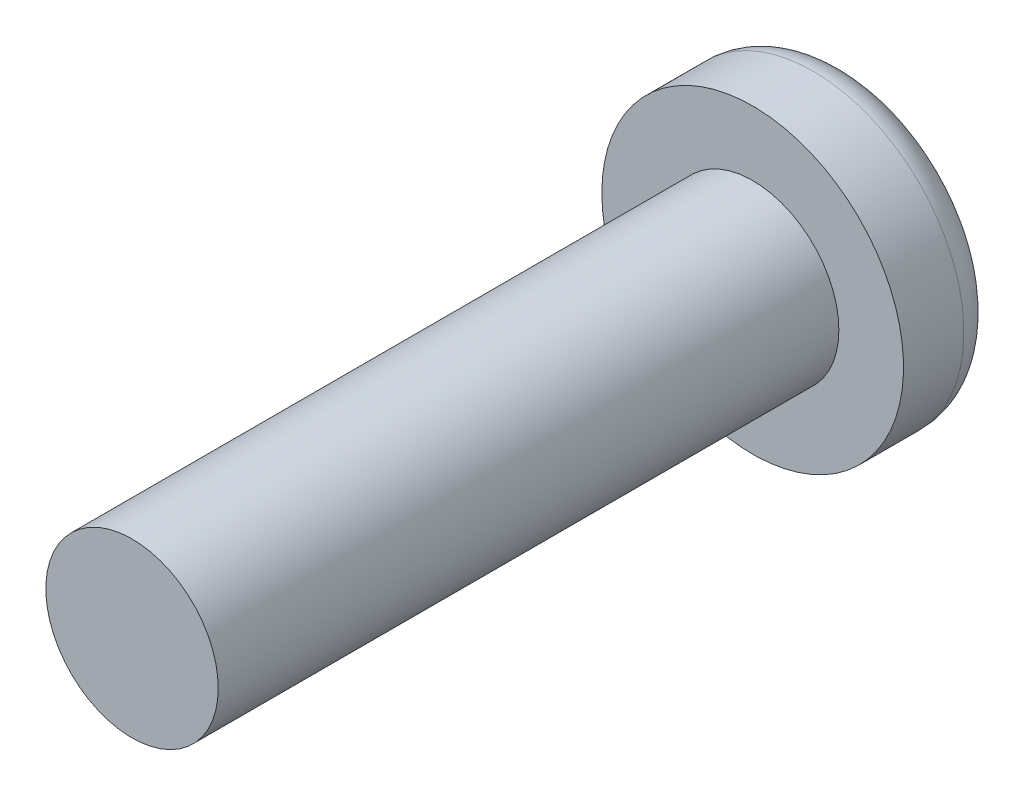
ISO-10303-21;
HEADER;
FILE_DESCRIPTION(('STEP AP214'),'2;1');
FILE_NAME('part.step','',(''),(''),'','','');
FILE_SCHEMA(('AUTOMOTIVE_DESIGN { 1 0 10303 214 1 1 1 1 }'));
ENDSEC;
DATA;
#1=APPLICATION_CONTEXT('core data for automotive mechanical design processes');
#2=APPLICATION_PROTOCOL_DEFINITION('international standard','automotive_design',2000,#1);
#3=PRODUCT_CONTEXT('',#1,'mechanical');
#4=PRODUCT('Part','Part','',(#3));
#5=PRODUCT_RELATED_PRODUCT_CATEGORY('part','',(#4));
#6=PRODUCT_DEFINITION_FORMATION('','',#4);
#7=PRODUCT_DEFINITION_CONTEXT('part definition',#1,'design');
#8=PRODUCT_DEFINITION('design','',#6,#7);
#9=PRODUCT_DEFINITION_SHAPE('','',#8);
#10=(LENGTH_UNIT() NAMED_UNIT(*) SI_UNIT(.MILLI.,.METRE.));
#11=(NAMED_UNIT(*) PLANE_ANGLE_UNIT() SI_UNIT($,.RADIAN.));
#12=(NAMED_UNIT(*) SI_UNIT($,.STERADIAN.) SOLID_ANGLE_UNIT());
#13=UNCERTAINTY_MEASURE_WITH_UNIT(LENGTH_MEASURE(1.E-05),#10,'distance_accuracy_value','');
#14=(GEOMETRIC_REPRESENTATION_CONTEXT(3) GLOBAL_UNCERTAINTY_ASSIGNED_CONTEXT((#13)) GLOBAL_UNIT_ASSIGNED_CONTEXT((#10,
#11,#12)) REPRESENTATION_CONTEXT('',''));
#15=CARTESIAN_POINT('',(0.,0.,0.));
#16=DIRECTION('',(0.,0.,1.));
#17=DIRECTION('',(1.,0.,0.));
#18=AXIS2_PLACEMENT_3D('',#15,#16,#17);
#19=CARTESIAN_POINT('',(0.,0.,36.));
#20=DIRECTION('',(0.,0.,-1.));
#21=DIRECTION('',(-1.,0.,0.));
#22=AXIS2_PLACEMENT_3D('',#19,#20,#21);
#23=CYLINDRICAL_SURFACE('',#22,5.);
#24=CARTESIAN_POINT('',(0.,0.,36.));
#25=DIRECTION('',(0.,0.,1.));
#26=DIRECTION('',(1.,0.,0.));
#27=AXIS2_PLACEMENT_3D('',#24,#25,#26);
#28=CIRCLE('',#27,5.);
#29=CARTESIAN_POINT('',(5.,0.,36.));
#30=VERTEX_POINT('',#29);
#31=EDGE_CURVE('E212',#30,#30,#28,.T.);
#32=ORIENTED_EDGE('',*,*,#31,.F.);
#33=EDGE_LOOP('',(#32));
#34=FACE_BOUND('',#33,.T.);
#35=CARTESIAN_POINT('',(0.,0.,0.));
#36=DIRECTION('',(0.,0.,1.));
#37=DIRECTION('',(1.,0.,0.));
#38=AXIS2_PLACEMENT_3D('',#35,#36,#37);
#39=CIRCLE('',#38,5.);
#40=CARTESIAN_POINT('',(5.,0.,0.));
#41=VERTEX_POINT('',#40);
#42=EDGE_CURVE('E211',#41,#41,#39,.T.);
#43=ORIENTED_EDGE('',*,*,#42,.T.);
#44=EDGE_LOOP('',(#43));
#45=FACE_BOUND('',#44,.T.);
#46=ADVANCED_FACE('F35',(#34,#45),#23,.T.);
#47=CARTESIAN_POINT('',(0.,0.,36.));
#48=DIRECTION('',(0.,0.,1.));
#49=DIRECTION('',(1.,0.,0.));
#50=AXIS2_PLACEMENT_3D('',#47,#48,#49);
#51=PLANE('',#50);
#52=ORIENTED_EDGE('',*,*,#31,.T.);
#53=EDGE_LOOP('',(#52));
#54=FACE_BOUND('',#53,.T.);
#55=ADVANCED_FACE('F235',(#54),#51,.T.);
#56=CARTESIAN_POINT('',(0.,0.,-5.5));
#57=DIRECTION('',(0.,0.,1.));
#58=DIRECTION('',(1.,0.,0.));
#59=AXIS2_PLACEMENT_3D('',#56,#57,#58);
#60=CYLINDRICAL_SURFACE('',#59,8.75);
#61=CARTESIAN_POINT('',(0.,0.,-3.5));
#62=DIRECTION('',(0.,0.,-1.));
#63=DIRECTION('',(-1.,0.,0.));
#64=AXIS2_PLACEMENT_3D('',#61,#62,#63);
#65=CIRCLE('',#64,8.75);
#66=CARTESIAN_POINT('',(-8.75,0.,-3.5));
#67=VERTEX_POINT('',#66);
#68=EDGE_CURVE('E11',#67,#67,#65,.F.);
#69=ORIENTED_EDGE('',*,*,#68,.T.);
#70=EDGE_LOOP('',(#69));
#71=FACE_BOUND('',#70,.T.);
#72=CARTESIAN_POINT('',(0.,0.,0.));
#73=DIRECTION('',(0.,0.,-1.));
#74=DIRECTION('',(-1.,0.,0.));
#75=AXIS2_PLACEMENT_3D('',#72,#73,#74);
#76=CIRCLE('',#75,8.75);
#77=CARTESIAN_POINT('',(-8.75,0.,0.));
#78=VERTEX_POINT('',#77);
#79=EDGE_CURVE('E191',#78,#78,#76,.T.);
#80=ORIENTED_EDGE('',*,*,#79,.T.);
#81=EDGE_LOOP('',(#80));
#82=FACE_BOUND('',#81,.T.);
#83=ADVANCED_FACE('F240',(#71,#82),#60,.T.);
#84=CARTESIAN_POINT('',(0.,0.,-5.5));
#85=DIRECTION('',(0.,0.,-1.));
#86=DIRECTION('',(-1.,0.,0.));
#87=AXIS2_PLACEMENT_3D('',#84,#85,#86);
#88=PLANE('',#87);
#89=DIRECTION('',(1.,0.,0.));
#90=VECTOR('',#89,1.);
#91=CARTESIAN_POINT('',(0.707106781186548,0.707106781186548,-5.5));
#92=LINE('',#91,#90);
#93=CARTESIAN_POINT('',(0.707106781186548,0.707106781186548,-5.5));
#94=VERTEX_POINT('',#93);
#95=CARTESIAN_POINT('',(6.00640165654039,0.70710678118661,-5.5));
#96=VERTEX_POINT('',#95);
#97=EDGE_CURVE('E50',#94,#96,#92,.T.);
#98=ORIENTED_EDGE('',*,*,#97,.F.);
#99=DIRECTION('',(0.,-1.,0.));
#100=VECTOR('',#99,1.);
#101=CARTESIAN_POINT('',(0.707106781186548,0.707106781186548,-5.5));
#102=LINE('',#101,#100);
#103=CARTESIAN_POINT('',(0.707106781186548,6.00640165654039,-5.5));
#104=VERTEX_POINT('',#103);
#105=EDGE_CURVE('E187',#104,#94,#102,.T.);
#106=ORIENTED_EDGE('',*,*,#105,.F.);
#107=DIRECTION('',(1.,0.,0.));
#108=VECTOR('',#107,1.);
#109=CARTESIAN_POINT('',(-0.707106781186548,6.00640165654039,-5.5));
#110=LINE('',#109,#108);
#111=CARTESIAN_POINT('',(-0.707106781186548,6.00640165654039,-5.5));
#112=VERTEX_POINT('',#111);
#113=EDGE_CURVE('E185',#112,#104,#110,.T.);
#114=ORIENTED_EDGE('',*,*,#113,.F.);
#115=DIRECTION('',(0.,1.,0.));
#116=VECTOR('',#115,1.);
#117=CARTESIAN_POINT('',(-0.707106781186548,0.707106781186548,-5.5));
#118=LINE('',#117,#116);
#119=CARTESIAN_POINT('',(-0.707106781186548,0.707106781186548,-5.5));
#120=VERTEX_POINT('',#119);
#121=EDGE_CURVE('E134',#120,#112,#118,.T.);
#122=ORIENTED_EDGE('',*,*,#121,.F.);
#123=DIRECTION('',(1.,0.,0.));
#124=VECTOR('',#123,1.);
#125=CARTESIAN_POINT('',(-0.707106781186548,0.707106781186548,-5.5));
#126=LINE('',#125,#124);
#127=CARTESIAN_POINT('',(-6.00640165654039,0.707106781186668,-5.5));
#128=VERTEX_POINT('',#127);
#129=EDGE_CURVE('E181',#128,#120,#126,.T.);
#130=ORIENTED_EDGE('',*,*,#129,.F.);
#131=DIRECTION('',(0.,1.,0.));
#132=VECTOR('',#131,1.);
#133=CARTESIAN_POINT('',(-6.00640165654039,-0.707106781186427,-5.5));
#134=LINE('',#133,#132);
#135=CARTESIAN_POINT('',(-6.00640165654039,-0.707106781186427,-5.5));
#136=VERTEX_POINT('',#135);
#137=EDGE_CURVE('E178',#136,#128,#134,.T.);
#138=ORIENTED_EDGE('',*,*,#137,.F.);
#139=DIRECTION('',(-1.,0.,0.));
#140=VECTOR('',#139,1.);
#141=CARTESIAN_POINT('',(-0.707106781186548,-0.707106781186548,-5.5));
#142=LINE('',#141,#140);
#143=CARTESIAN_POINT('',(-0.707106781186548,-0.707106781186548,-5.5));
#144=VERTEX_POINT('',#143);
#145=EDGE_CURVE('E175',#144,#136,#142,.T.);
#146=ORIENTED_EDGE('',*,*,#145,.F.);
#147=DIRECTION('',(0.,1.,0.));
#148=VECTOR('',#147,1.);
#149=CARTESIAN_POINT('',(-0.707106781186548,-0.707106781186548,-5.5));
#150=LINE('',#149,#148);
#151=CARTESIAN_POINT('',(-0.707106781186548,-6.00640165654039,-5.5));
#152=VERTEX_POINT('',#151);
#153=EDGE_CURVE('E172',#152,#144,#150,.T.);
#154=ORIENTED_EDGE('',*,*,#153,.F.);
#155=DIRECTION('',(-1.,0.,0.));
#156=VECTOR('',#155,1.);
#157=CARTESIAN_POINT('',(0.707106781186547,-6.00640165654039,-5.5));
#158=LINE('',#157,#156);
#159=CARTESIAN_POINT('',(0.707106781186547,-6.00640165654039,-5.5));
#160=VERTEX_POINT('',#159);
#161=EDGE_CURVE('E169',#160,#152,#158,.T.);
#162=ORIENTED_EDGE('',*,*,#161,.F.);
#163=DIRECTION('',(0.,-1.,0.));
#164=VECTOR('',#163,1.);
#165=CARTESIAN_POINT('',(0.707106781186547,-0.707106781186548,-5.5));
#166=LINE('',#165,#164);
#167=CARTESIAN_POINT('',(0.707106781186547,-0.707106781186548,-5.5));
#168=VERTEX_POINT('',#167);
#169=EDGE_CURVE('E166',#168,#160,#166,.T.);
#170=ORIENTED_EDGE('',*,*,#169,.F.);
#171=DIRECTION('',(-1.,0.,0.));
#172=VECTOR('',#171,1.);
#173=CARTESIAN_POINT('',(0.707106781186547,-0.707106781186548,-5.5));
#174=LINE('',#173,#172);
#175=CARTESIAN_POINT('',(6.00640165654027,-0.707106781186549,-5.5));
#176=VERTEX_POINT('',#175);
#177=EDGE_CURVE('E163',#176,#168,#174,.T.);
#178=ORIENTED_EDGE('',*,*,#177,.F.);
#179=DIRECTION('',(0.,-1.,0.));
#180=VECTOR('',#179,1.);
#181=CARTESIAN_POINT('',(6.00640165654039,0.70710678118661,-5.5));
#182=LINE('',#181,#180);
#183=EDGE_CURVE('E160',#96,#176,#182,.T.);
#184=ORIENTED_EDGE('',*,*,#183,.F.);
#185=EDGE_LOOP('',(#98,#106,#114,#122,#130,#138,#146,#154,#162,#170,#178,#184));
#186=FACE_BOUND('',#185,.T.);
#187=CARTESIAN_POINT('',(0.,0.,-5.5));
#188=DIRECTION('',(0.,0.,-1.));
#189=DIRECTION('',(-1.,0.,0.));
#190=AXIS2_PLACEMENT_3D('',#187,#188,#189);
#191=CIRCLE('',#190,6.75);
#192=CARTESIAN_POINT('',(-6.75,0.,-5.5));
#193=VERTEX_POINT('',#192);
#194=EDGE_CURVE('E43',#193,#193,#191,.T.);
#195=ORIENTED_EDGE('',*,*,#194,.T.);
#196=EDGE_LOOP('',(#195));
#197=FACE_BOUND('',#196,.T.);
#198=ADVANCED_FACE('F219',(#186,#197),#88,.T.);
#199=CARTESIAN_POINT('',(0.,0.,0.));
#200=DIRECTION('',(0.,0.,-1.));
#201=DIRECTION('',(-1.,0.,0.));
#202=AXIS2_PLACEMENT_3D('',#199,#200,#201);
#203=PLANE('',#202);
#204=ORIENTED_EDGE('',*,*,#42,.F.);
#205=EDGE_LOOP('',(#204));
#206=FACE_BOUND('',#205,.T.);
#207=ORIENTED_EDGE('',*,*,#79,.F.);
#208=EDGE_LOOP('',(#207));
#209=FACE_BOUND('',#208,.T.);
#210=ADVANCED_FACE('F223',(#206,#209),#203,.F.);
#211=CARTESIAN_POINT('',(0.,0.,-3.5));
#212=DIRECTION('',(0.,0.,-1.));
#213=DIRECTION('',(-1.,0.,0.));
#214=AXIS2_PLACEMENT_3D('',#211,#212,#213);
#215=TOROIDAL_SURFACE('',#214,6.75,2.);
#216=ORIENTED_EDGE('',*,*,#68,.F.);
#217=EDGE_LOOP('',(#216));
#218=FACE_BOUND('',#217,.T.);
#219=ORIENTED_EDGE('',*,*,#194,.F.);
#220=EDGE_LOOP('',(#219));
#221=FACE_BOUND('',#220,.T.);
#222=ADVANCED_FACE('F37',(#218,#221),#215,.T.);
#223=CARTESIAN_POINT('',(0.707106781186548,0.707106781186548,-3.5));
#224=DIRECTION('',(0.,1.,0.));
#225=DIRECTION('',(-1.,0.,0.));
#226=AXIS2_PLACEMENT_3D('',#223,#224,#225);
#227=PLANE('',#226);
#228=ORIENTED_EDGE('',*,*,#97,.T.);
#229=DIRECTION('',(0.,0.,-1.));
#230=VECTOR('',#229,1.);
#231=CARTESIAN_POINT('',(6.00640165654039,0.70710678118661,-3.5));
#232=LINE('',#231,#230);
#233=CARTESIAN_POINT('',(6.00640165654039,0.70710678118661,-3.5));
#234=VERTEX_POINT('',#233);
#235=EDGE_CURVE('E98',#234,#96,#232,.T.);
#236=ORIENTED_EDGE('',*,*,#235,.F.);
#237=DIRECTION('',(1.,0.,0.));
#238=VECTOR('',#237,1.);
#239=CARTESIAN_POINT('',(0.707106781186548,0.707106781186548,-3.5));
#240=LINE('',#239,#238);
#241=CARTESIAN_POINT('',(0.707106781186548,0.707106781186548,-3.5));
#242=VERTEX_POINT('',#241);
#243=EDGE_CURVE('E189',#242,#234,#240,.T.);
#244=ORIENTED_EDGE('',*,*,#243,.F.);
#245=DIRECTION('',(0.,0.,-1.));
#246=VECTOR('',#245,1.);
#247=CARTESIAN_POINT('',(0.707106781186548,0.707106781186548,-3.5));
#248=LINE('',#247,#246);
#249=EDGE_CURVE('E58',#242,#94,#248,.T.);
#250=ORIENTED_EDGE('',*,*,#249,.T.);
#251=EDGE_LOOP('',(#228,#236,#244,#250));
#252=FACE_BOUND('',#251,.T.);
#253=ADVANCED_FACE('F222',(#252),#227,.F.);
#254=CARTESIAN_POINT('',(0.707106781186548,0.707106781186548,-3.5));
#255=DIRECTION('',(1.,0.,0.));
#256=DIRECTION('',(0.,0.,-1.));
#257=AXIS2_PLACEMENT_3D('',#254,#255,#256);
#258=PLANE('',#257);
#259=ORIENTED_EDGE('',*,*,#105,.T.);
#260=ORIENTED_EDGE('',*,*,#249,.F.);
#261=DIRECTION('',(0.,-1.,0.));
#262=VECTOR('',#261,1.);
#263=CARTESIAN_POINT('',(0.707106781186548,0.707106781186548,-3.5));
#264=LINE('',#263,#262);
#265=CARTESIAN_POINT('',(0.707106781186548,6.00640165654039,-3.5));
#266=VERTEX_POINT('',#265);
#267=EDGE_CURVE('E146',#266,#242,#264,.T.);
#268=ORIENTED_EDGE('',*,*,#267,.F.);
#269=DIRECTION('',(0.,0.,-1.));
#270=VECTOR('',#269,1.);
#271=CARTESIAN_POINT('',(0.707106781186548,6.00640165654039,-3.5));
#272=LINE('',#271,#270);
#273=EDGE_CURVE('E138',#266,#104,#272,.T.);
#274=ORIENTED_EDGE('',*,*,#273,.T.);
#275=EDGE_LOOP('',(#259,#260,#268,#274));
#276=FACE_BOUND('',#275,.T.);
#277=ADVANCED_FACE('F229',(#276),#258,.F.);
#278=CARTESIAN_POINT('',(-0.707106781186548,6.00640165654039,-3.5));
#279=DIRECTION('',(0.,1.,0.));
#280=DIRECTION('',(0.,0.,1.));
#281=AXIS2_PLACEMENT_3D('',#278,#279,#280);
#282=PLANE('',#281);
#283=ORIENTED_EDGE('',*,*,#113,.T.);
#284=ORIENTED_EDGE('',*,*,#273,.F.);
#285=DIRECTION('',(1.,0.,0.));
#286=VECTOR('',#285,1.);
#287=CARTESIAN_POINT('',(-0.707106781186548,6.00640165654039,-3.5));
#288=LINE('',#287,#286);
#289=CARTESIAN_POINT('',(-0.707106781186548,6.00640165654039,-3.5));
#290=VERTEX_POINT('',#289);
#291=EDGE_CURVE('E142',#290,#266,#288,.T.);
#292=ORIENTED_EDGE('',*,*,#291,.F.);
#293=DIRECTION('',(0.,0.,-1.));
#294=VECTOR('',#293,1.);
#295=CARTESIAN_POINT('',(-0.707106781186548,6.00640165654039,-3.5));
#296=LINE('',#295,#294);
#297=EDGE_CURVE('E127',#290,#112,#296,.T.);
#298=ORIENTED_EDGE('',*,*,#297,.T.);
#299=EDGE_LOOP('',(#283,#284,#292,#298));
#300=FACE_BOUND('',#299,.T.);
#301=ADVANCED_FACE('F143',(#300),#282,.F.);
#302=CARTESIAN_POINT('',(-0.707106781186548,0.707106781186548,-3.5));
#303=DIRECTION('',(-1.,0.,0.));
#304=DIRECTION('',(0.,0.,1.));
#305=AXIS2_PLACEMENT_3D('',#302,#303,#304);
#306=PLANE('',#305);
#307=ORIENTED_EDGE('',*,*,#121,.T.);
#308=ORIENTED_EDGE('',*,*,#297,.F.);
#309=DIRECTION('',(0.,1.,0.));
#310=VECTOR('',#309,1.);
#311=CARTESIAN_POINT('',(-0.707106781186548,0.707106781186548,-3.5));
#312=LINE('',#311,#310);
#313=CARTESIAN_POINT('',(-0.707106781186548,0.707106781186548,-3.5));
#314=VERTEX_POINT('',#313);
#315=EDGE_CURVE('E131',#314,#290,#312,.T.);
#316=ORIENTED_EDGE('',*,*,#315,.F.);
#317=DIRECTION('',(0.,0.,-1.));
#318=VECTOR('',#317,1.);
#319=CARTESIAN_POINT('',(-0.707106781186548,0.707106781186548,-3.5));
#320=LINE('',#319,#318);
#321=EDGE_CURVE('E139',#314,#120,#320,.T.);
#322=ORIENTED_EDGE('',*,*,#321,.T.);
#323=EDGE_LOOP('',(#307,#308,#316,#322));
#324=FACE_BOUND('',#323,.T.);
#325=ADVANCED_FACE('F129',(#324),#306,.F.);
#326=CARTESIAN_POINT('',(-0.707106781186548,0.707106781186548,-3.5));
#327=DIRECTION('',(0.,1.,0.));
#328=DIRECTION('',(-1.,0.,0.));
#329=AXIS2_PLACEMENT_3D('',#326,#327,#328);
#330=PLANE('',#329);
#331=ORIENTED_EDGE('',*,*,#129,.T.);
#332=ORIENTED_EDGE('',*,*,#321,.F.);
#333=DIRECTION('',(1.,0.,0.));
#334=VECTOR('',#333,1.);
#335=CARTESIAN_POINT('',(-0.707106781186548,0.707106781186548,-3.5));
#336=LINE('',#335,#334);
#337=CARTESIAN_POINT('',(-6.00640165654039,0.707106781186668,-3.5));
#338=VERTEX_POINT('',#337);
#339=EDGE_CURVE('E152',#338,#314,#336,.T.);
#340=ORIENTED_EDGE('',*,*,#339,.F.);
#341=DIRECTION('',(0.,0.,-1.));
#342=VECTOR('',#341,1.);
#343=CARTESIAN_POINT('',(-6.00640165654039,0.707106781186668,-3.5));
#344=LINE('',#343,#342);
#345=EDGE_CURVE('E194',#338,#128,#344,.T.);
#346=ORIENTED_EDGE('',*,*,#345,.T.);
#347=EDGE_LOOP('',(#331,#332,#340,#346));
#348=FACE_BOUND('',#347,.T.);
#349=ADVANCED_FACE('F279',(#348),#330,.F.);
#350=CARTESIAN_POINT('',(-6.00640165654039,-0.707106781186427,-3.5));
#351=DIRECTION('',(-1.,0.,0.));
#352=DIRECTION('',(0.,0.,1.));
#353=AXIS2_PLACEMENT_3D('',#350,#351,#352);
#354=PLANE('',#353);
#355=ORIENTED_EDGE('',*,*,#137,.T.);
#356=ORIENTED_EDGE('',*,*,#345,.F.);
#357=DIRECTION('',(0.,1.,0.));
#358=VECTOR('',#357,1.);
#359=CARTESIAN_POINT('',(-6.00640165654039,-0.707106781186427,-3.5));
#360=LINE('',#359,#358);
#361=CARTESIAN_POINT('',(-6.00640165654039,-0.707106781186427,-3.5));
#362=VERTEX_POINT('',#361);
#363=EDGE_CURVE('E154',#362,#338,#360,.T.);
#364=ORIENTED_EDGE('',*,*,#363,.F.);
#365=DIRECTION('',(0.,0.,-1.));
#366=VECTOR('',#365,1.);
#367=CARTESIAN_POINT('',(-6.00640165654039,-0.707106781186427,-3.5));
#368=LINE('',#367,#366);
#369=EDGE_CURVE('E196',#362,#136,#368,.T.);
#370=ORIENTED_EDGE('',*,*,#369,.T.);
#371=EDGE_LOOP('',(#355,#356,#364,#370));
#372=FACE_BOUND('',#371,.T.);
#373=ADVANCED_FACE('F275',(#372),#354,.F.);
#374=CARTESIAN_POINT('',(-0.707106781186548,-0.707106781186548,-3.5));
#375=DIRECTION('',(0.,-1.,0.));
#376=DIRECTION('',(1.,0.,0.));
#377=AXIS2_PLACEMENT_3D('',#374,#375,#376);
#378=PLANE('',#377);
#379=ORIENTED_EDGE('',*,*,#145,.T.);
#380=ORIENTED_EDGE('',*,*,#369,.F.);
#381=DIRECTION('',(-1.,0.,0.));
#382=VECTOR('',#381,1.);
#383=CARTESIAN_POINT('',(-0.707106781186548,-0.707106781186548,-3.5));
#384=LINE('',#383,#382);
#385=CARTESIAN_POINT('',(-0.707106781186548,-0.707106781186548,-3.5));
#386=VERTEX_POINT('',#385);
#387=EDGE_CURVE('E423',#386,#362,#384,.T.);
#388=ORIENTED_EDGE('',*,*,#387,.F.);
#389=DIRECTION('',(0.,0.,-1.));
#390=VECTOR('',#389,1.);
#391=CARTESIAN_POINT('',(-0.707106781186548,-0.707106781186548,-3.5));
#392=LINE('',#391,#390);
#393=EDGE_CURVE('E198',#386,#144,#392,.T.);
#394=ORIENTED_EDGE('',*,*,#393,.T.);
#395=EDGE_LOOP('',(#379,#380,#388,#394));
#396=FACE_BOUND('',#395,.T.);
#397=ADVANCED_FACE('F271',(#396),#378,.F.);
#398=CARTESIAN_POINT('',(-0.707106781186548,-0.707106781186548,-3.5));
#399=DIRECTION('',(-1.,0.,0.));
#400=DIRECTION('',(0.,-1.,0.));
#401=AXIS2_PLACEMENT_3D('',#398,#399,#400);
#402=PLANE('',#401);
#403=ORIENTED_EDGE('',*,*,#153,.T.);
#404=ORIENTED_EDGE('',*,*,#393,.F.);
#405=DIRECTION('',(0.,1.,0.));
#406=VECTOR('',#405,1.);
#407=CARTESIAN_POINT('',(-0.707106781186548,-0.707106781186548,-3.5));
#408=LINE('',#407,#406);
#409=CARTESIAN_POINT('',(-0.707106781186548,-6.00640165654039,-3.5));
#410=VERTEX_POINT('',#409);
#411=EDGE_CURVE('E420',#410,#386,#408,.T.);
#412=ORIENTED_EDGE('',*,*,#411,.F.);
#413=DIRECTION('',(0.,0.,-1.));
#414=VECTOR('',#413,1.);
#415=CARTESIAN_POINT('',(-0.707106781186548,-6.00640165654039,-3.5));
#416=LINE('',#415,#414);
#417=EDGE_CURVE('E200',#410,#152,#416,.T.);
#418=ORIENTED_EDGE('',*,*,#417,.T.);
#419=EDGE_LOOP('',(#403,#404,#412,#418));
#420=FACE_BOUND('',#419,.T.);
#421=ADVANCED_FACE('F267',(#420),#402,.F.);
#422=CARTESIAN_POINT('',(0.707106781186547,-6.00640165654039,-3.5));
#423=DIRECTION('',(0.,-1.,0.));
#424=DIRECTION('',(0.,0.,-1.));
#425=AXIS2_PLACEMENT_3D('',#422,#423,#424);
#426=PLANE('',#425);
#427=ORIENTED_EDGE('',*,*,#161,.T.);
#428=ORIENTED_EDGE('',*,*,#417,.F.);
#429=DIRECTION('',(-1.,0.,0.));
#430=VECTOR('',#429,1.);
#431=CARTESIAN_POINT('',(0.707106781186547,-6.00640165654039,-3.5));
#432=LINE('',#431,#430);
#433=CARTESIAN_POINT('',(0.707106781186547,-6.00640165654039,-3.5));
#434=VERTEX_POINT('',#433);
#435=EDGE_CURVE('E417',#434,#410,#432,.T.);
#436=ORIENTED_EDGE('',*,*,#435,.F.);
#437=DIRECTION('',(0.,0.,-1.));
#438=VECTOR('',#437,1.);
#439=CARTESIAN_POINT('',(0.707106781186547,-6.00640165654039,-3.5));
#440=LINE('',#439,#438);
#441=EDGE_CURVE('E202',#434,#160,#440,.T.);
#442=ORIENTED_EDGE('',*,*,#441,.T.);
#443=EDGE_LOOP('',(#427,#428,#436,#442));
#444=FACE_BOUND('',#443,.T.);
#445=ADVANCED_FACE('F263',(#444),#426,.F.);
#446=CARTESIAN_POINT('',(0.707106781186547,-0.707106781186548,-3.5));
#447=DIRECTION('',(1.,0.,0.));
#448=DIRECTION('',(0.,1.,0.));
#449=AXIS2_PLACEMENT_3D('',#446,#447,#448);
#450=PLANE('',#449);
#451=ORIENTED_EDGE('',*,*,#169,.T.);
#452=ORIENTED_EDGE('',*,*,#441,.F.);
#453=DIRECTION('',(0.,-1.,0.));
#454=VECTOR('',#453,1.);
#455=CARTESIAN_POINT('',(0.707106781186547,-0.707106781186548,-3.5));
#456=LINE('',#455,#454);
#457=CARTESIAN_POINT('',(0.707106781186547,-0.707106781186548,-3.5));
#458=VERTEX_POINT('',#457);
#459=EDGE_CURVE('E414',#458,#434,#456,.T.);
#460=ORIENTED_EDGE('',*,*,#459,.F.);
#461=DIRECTION('',(0.,0.,-1.));
#462=VECTOR('',#461,1.);
#463=CARTESIAN_POINT('',(0.707106781186547,-0.707106781186548,-3.5));
#464=LINE('',#463,#462);
#465=EDGE_CURVE('E204',#458,#168,#464,.T.);
#466=ORIENTED_EDGE('',*,*,#465,.T.);
#467=EDGE_LOOP('',(#451,#452,#460,#466));
#468=FACE_BOUND('',#467,.T.);
#469=ADVANCED_FACE('F259',(#468),#450,.F.);
#470=CARTESIAN_POINT('',(0.707106781186547,-0.707106781186548,-3.5));
#471=DIRECTION('',(0.,-1.,0.));
#472=DIRECTION('',(1.,0.,0.));
#473=AXIS2_PLACEMENT_3D('',#470,#471,#472);
#474=PLANE('',#473);
#475=ORIENTED_EDGE('',*,*,#177,.T.);
#476=ORIENTED_EDGE('',*,*,#465,.F.);
#477=DIRECTION('',(-1.,0.,0.));
#478=VECTOR('',#477,1.);
#479=CARTESIAN_POINT('',(0.707106781186547,-0.707106781186548,-3.5));
#480=LINE('',#479,#478);
#481=CARTESIAN_POINT('',(6.00640165654027,-0.707106781186549,-3.5));
#482=VERTEX_POINT('',#481);
#483=EDGE_CURVE('E409',#482,#458,#480,.T.);
#484=ORIENTED_EDGE('',*,*,#483,.F.);
#485=DIRECTION('',(0.,0.,-1.));
#486=VECTOR('',#485,1.);
#487=CARTESIAN_POINT('',(6.00640165654027,-0.707106781186549,-3.5));
#488=LINE('',#487,#486);
#489=EDGE_CURVE('E206',#482,#176,#488,.T.);
#490=ORIENTED_EDGE('',*,*,#489,.T.);
#491=EDGE_LOOP('',(#475,#476,#484,#490));
#492=FACE_BOUND('',#491,.T.);
#493=ADVANCED_FACE('F255',(#492),#474,.F.);
#494=CARTESIAN_POINT('',(6.00640165654039,0.70710678118661,-3.5));
#495=DIRECTION('',(1.,0.,0.));
#496=DIRECTION('',(0.,1.,0.));
#497=AXIS2_PLACEMENT_3D('',#494,#495,#496);
#498=PLANE('',#497);
#499=ORIENTED_EDGE('',*,*,#183,.T.);
#500=ORIENTED_EDGE('',*,*,#489,.F.);
#501=DIRECTION('',(0.,-1.,0.));
#502=VECTOR('',#501,1.);
#503=CARTESIAN_POINT('',(6.00640165654039,0.70710678118661,-3.5));
#504=LINE('',#503,#502);
#505=EDGE_CURVE('E407',#234,#482,#504,.T.);
#506=ORIENTED_EDGE('',*,*,#505,.F.);
#507=ORIENTED_EDGE('',*,*,#235,.T.);
#508=EDGE_LOOP('',(#499,#500,#506,#507));
#509=FACE_BOUND('',#508,.T.);
#510=ADVANCED_FACE('F252',(#509),#498,.F.);
#511=CARTESIAN_POINT('',(0.,0.,-3.5));
#512=DIRECTION('',(0.,0.,-1.));
#513=DIRECTION('',(-1.,0.,0.));
#514=AXIS2_PLACEMENT_3D('',#511,#512,#513);
#515=PLANE('',#514);
#516=ORIENTED_EDGE('',*,*,#243,.T.);
#517=ORIENTED_EDGE('',*,*,#505,.T.);
#518=ORIENTED_EDGE('',*,*,#483,.T.);
#519=ORIENTED_EDGE('',*,*,#459,.T.);
#520=ORIENTED_EDGE('',*,*,#435,.T.);
#521=ORIENTED_EDGE('',*,*,#411,.T.);
#522=ORIENTED_EDGE('',*,*,#387,.T.);
#523=ORIENTED_EDGE('',*,*,#363,.T.);
#524=ORIENTED_EDGE('',*,*,#339,.T.);
#525=ORIENTED_EDGE('',*,*,#315,.T.);
#526=ORIENTED_EDGE('',*,*,#291,.T.);
#527=ORIENTED_EDGE('',*,*,#267,.T.);
#528=EDGE_LOOP('',(#516,#517,#518,#519,#520,#521,#522,#523,#524,#525,#526,#527));
#529=FACE_BOUND('',#528,.T.);
#530=ADVANCED_FACE('F149',(#529),#515,.T.);
#531=CLOSED_SHELL('',(#46,#55,#83,#198,#210,#222,#253,#277,#301,#325,#349,#373,#397,#421,#445,
#469,#493,#510,#530));
#532=MANIFOLD_SOLID_BREP('B2',#531);
#533=ADVANCED_BREP_SHAPE_REPRESENTATION('',(#18,#532),#14);
#534=SHAPE_DEFINITION_REPRESENTATION(#9,#533);
ENDSEC;
END-ISO-10303-21;
